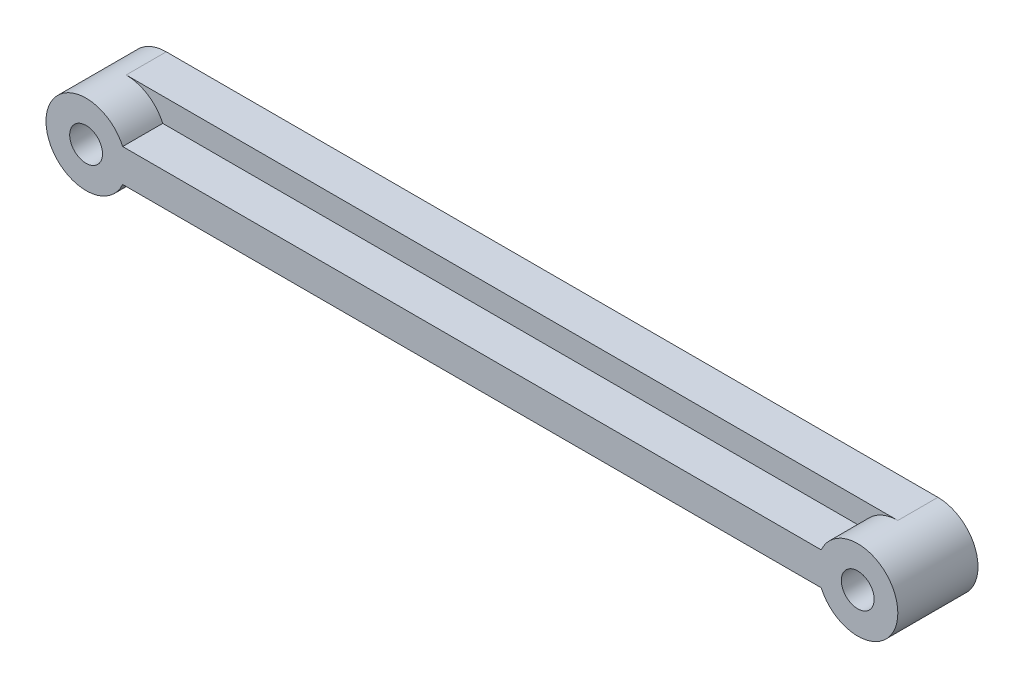
ISO-10303-21;
HEADER;
FILE_DESCRIPTION(('STEP AP214'),'2;1');
FILE_NAME('part.step','',(''),(''),'','','');
FILE_SCHEMA(('AUTOMOTIVE_DESIGN { 1 0 10303 214 1 1 1 1 }'));
ENDSEC;
DATA;
#1=APPLICATION_CONTEXT('core data for automotive mechanical design processes');
#2=APPLICATION_PROTOCOL_DEFINITION('international standard','automotive_design',2000,#1);
#3=PRODUCT_CONTEXT('',#1,'mechanical');
#4=PRODUCT('Part','Part','',(#3));
#5=PRODUCT_RELATED_PRODUCT_CATEGORY('part','',(#4));
#6=PRODUCT_DEFINITION_FORMATION('','',#4);
#7=PRODUCT_DEFINITION_CONTEXT('part definition',#1,'design');
#8=PRODUCT_DEFINITION('design','',#6,#7);
#9=PRODUCT_DEFINITION_SHAPE('','',#8);
#10=(LENGTH_UNIT() NAMED_UNIT(*) SI_UNIT(.MILLI.,.METRE.));
#11=(NAMED_UNIT(*) PLANE_ANGLE_UNIT() SI_UNIT($,.RADIAN.));
#12=(NAMED_UNIT(*) SI_UNIT($,.STERADIAN.) SOLID_ANGLE_UNIT());
#13=UNCERTAINTY_MEASURE_WITH_UNIT(LENGTH_MEASURE(1.E-05),#10,'distance_accuracy_value','');
#14=(GEOMETRIC_REPRESENTATION_CONTEXT(3) GLOBAL_UNCERTAINTY_ASSIGNED_CONTEXT((#13)) GLOBAL_UNIT_ASSIGNED_CONTEXT((#10,
#11,#12)) REPRESENTATION_CONTEXT('',''));
#15=CARTESIAN_POINT('',(0.,0.,0.));
#16=DIRECTION('',(0.,0.,1.));
#17=DIRECTION('',(1.,0.,0.));
#18=AXIS2_PLACEMENT_3D('',#15,#16,#17);
#19=CARTESIAN_POINT('',(-45.8845054429269,0.,0.));
#20=DIRECTION('',(0.,0.,1.));
#21=DIRECTION('',(1.,0.,0.));
#22=AXIS2_PLACEMENT_3D('',#19,#20,#21);
#23=PLANE('',#22);
#24=CARTESIAN_POINT('',(-7.38450544292694,0.,0.));
#25=DIRECTION('',(0.,0.,1.));
#26=DIRECTION('',(1.,0.,0.));
#27=AXIS2_PLACEMENT_3D('',#24,#25,#26);
#28=CIRCLE('',#27,2.);
#29=CARTESIAN_POINT('',(-9.20907538642467,-0.819112032193816,0.));
#30=VERTEX_POINT('',#29);
#31=CARTESIAN_POINT('',(-7.38450544292694,-2.,0.));
#32=VERTEX_POINT('',#31);
#33=EDGE_CURVE('E57',#30,#32,#28,.T.);
#34=ORIENTED_EDGE('',*,*,#33,.F.);
#35=DIRECTION('',(1.,0.,0.));
#36=VECTOR('',#35,1.);
#37=CARTESIAN_POINT('',(-44.0599354994292,-0.819112032193814,0.));
#38=LINE('',#37,#36);
#39=CARTESIAN_POINT('',(-44.0599354994292,-0.819112032193815,0.));
#40=VERTEX_POINT('',#39);
#41=EDGE_CURVE('E61',#40,#30,#38,.T.);
#42=ORIENTED_EDGE('',*,*,#41,.F.);
#43=CARTESIAN_POINT('',(-45.8845054429269,0.,0.));
#44=DIRECTION('',(0.,0.,1.));
#45=DIRECTION('',(1.,0.,0.));
#46=AXIS2_PLACEMENT_3D('',#43,#44,#45);
#47=CIRCLE('',#46,2.);
#48=CARTESIAN_POINT('',(-45.8845054429269,-2.,0.));
#49=VERTEX_POINT('',#48);
#50=EDGE_CURVE('E11',#49,#40,#47,.T.);
#51=ORIENTED_EDGE('',*,*,#50,.F.);
#52=DIRECTION('',(1.,0.,0.));
#53=VECTOR('',#52,1.);
#54=CARTESIAN_POINT('',(-45.8845054429269,-2.,0.));
#55=LINE('',#54,#53);
#56=EDGE_CURVE('E141',#49,#32,#55,.T.);
#57=ORIENTED_EDGE('',*,*,#56,.T.);
#58=EDGE_LOOP('',(#34,#42,#51,#57));
#59=FACE_BOUND('',#58,.T.);
#60=ADVANCED_FACE('F39',(#59),#23,.T.);
#61=CARTESIAN_POINT('',(-45.8845054429269,0.,-2.));
#62=DIRECTION('',(0.,0.,1.));
#63=DIRECTION('',(1.,0.,0.));
#64=AXIS2_PLACEMENT_3D('',#61,#62,#63);
#65=CYLINDRICAL_SURFACE('',#64,2.);
#66=DIRECTION('',(0.,0.,1.));
#67=VECTOR('',#66,1.);
#68=CARTESIAN_POINT('',(-45.8845054429269,-2.,-2.));
#69=LINE('',#68,#67);
#70=CARTESIAN_POINT('',(-45.8845054429269,-2.,-2.));
#71=VERTEX_POINT('',#70);
#72=EDGE_CURVE('E43',#71,#49,#69,.T.);
#73=ORIENTED_EDGE('',*,*,#72,.T.);
#74=ORIENTED_EDGE('',*,*,#50,.T.);
#75=DIRECTION('',(0.,0.,-1.));
#76=VECTOR('',#75,1.);
#77=CARTESIAN_POINT('',(-44.0599354994292,-0.819112032193815,2.));
#78=LINE('',#77,#76);
#79=CARTESIAN_POINT('',(-44.0599354994292,-0.819112032193815,2.));
#80=VERTEX_POINT('',#79);
#81=EDGE_CURVE('E135',#80,#40,#78,.T.);
#82=ORIENTED_EDGE('',*,*,#81,.F.);
#83=CARTESIAN_POINT('',(-45.8845054429269,0.,2.));
#84=DIRECTION('',(0.,0.,1.));
#85=DIRECTION('',(1.,0.,0.));
#86=AXIS2_PLACEMENT_3D('',#83,#84,#85);
#87=CIRCLE('',#86,2.);
#88=CARTESIAN_POINT('',(-44.0599354994292,0.819112032193814,2.));
#89=VERTEX_POINT('',#88);
#90=EDGE_CURVE('E115',#89,#80,#87,.T.);
#91=ORIENTED_EDGE('',*,*,#90,.F.);
#92=DIRECTION('',(0.,0.,-1.));
#93=VECTOR('',#92,1.);
#94=CARTESIAN_POINT('',(-44.0599354994292,0.819112032193814,2.));
#95=LINE('',#94,#93);
#96=CARTESIAN_POINT('',(-44.0599354994292,0.819112032193814,0.));
#97=VERTEX_POINT('',#96);
#98=EDGE_CURVE('E112',#89,#97,#95,.T.);
#99=ORIENTED_EDGE('',*,*,#98,.T.);
#100=CARTESIAN_POINT('',(-45.8845054429269,2.,0.));
#101=VERTEX_POINT('',#100);
#102=EDGE_CURVE('E50',#97,#101,#47,.T.);
#103=ORIENTED_EDGE('',*,*,#102,.T.);
#104=DIRECTION('',(0.,0.,1.));
#105=VECTOR('',#104,1.);
#106=CARTESIAN_POINT('',(-45.8845054429269,2.,-2.));
#107=LINE('',#106,#105);
#108=CARTESIAN_POINT('',(-45.8845054429269,2.,-2.));
#109=VERTEX_POINT('',#108);
#110=EDGE_CURVE('E158',#109,#101,#107,.T.);
#111=ORIENTED_EDGE('',*,*,#110,.F.);
#112=CARTESIAN_POINT('',(-45.8845054429269,0.,-2.));
#113=DIRECTION('',(0.,0.,1.));
#114=DIRECTION('',(1.,0.,0.));
#115=AXIS2_PLACEMENT_3D('',#112,#113,#114);
#116=CIRCLE('',#115,2.);
#117=EDGE_CURVE('E142',#109,#71,#116,.T.);
#118=ORIENTED_EDGE('',*,*,#117,.T.);
#119=EDGE_LOOP('',(#73,#74,#82,#91,#99,#103,#111,#118));
#120=FACE_BOUND('',#119,.T.);
#121=ADVANCED_FACE('F41',(#120),#65,.T.);
#122=CARTESIAN_POINT('',(-45.8845054429269,2.,-2.));
#123=DIRECTION('',(0.,1.,0.));
#124=DIRECTION('',(-1.,0.,0.));
#125=AXIS2_PLACEMENT_3D('',#122,#123,#124);
#126=PLANE('',#125);
#127=DIRECTION('',(-1.,0.,0.));
#128=VECTOR('',#127,1.);
#129=CARTESIAN_POINT('',(-45.8845054429269,2.,0.));
#130=LINE('',#129,#128);
#131=CARTESIAN_POINT('',(-7.38450544292694,2.,0.));
#132=VERTEX_POINT('',#131);
#133=EDGE_CURVE('E146',#132,#101,#130,.T.);
#134=ORIENTED_EDGE('',*,*,#133,.F.);
#135=DIRECTION('',(0.,0.,1.));
#136=VECTOR('',#135,1.);
#137=CARTESIAN_POINT('',(-7.38450544292694,2.,-2.));
#138=LINE('',#137,#136);
#139=CARTESIAN_POINT('',(-7.38450544292694,2.,-2.));
#140=VERTEX_POINT('',#139);
#141=EDGE_CURVE('E160',#140,#132,#138,.T.);
#142=ORIENTED_EDGE('',*,*,#141,.F.);
#143=DIRECTION('',(-1.,0.,0.));
#144=VECTOR('',#143,1.);
#145=CARTESIAN_POINT('',(-45.8845054429269,2.,-2.));
#146=LINE('',#145,#144);
#147=EDGE_CURVE('E152',#140,#109,#146,.T.);
#148=ORIENTED_EDGE('',*,*,#147,.T.);
#149=ORIENTED_EDGE('',*,*,#110,.T.);
#150=EDGE_LOOP('',(#134,#142,#148,#149));
#151=FACE_BOUND('',#150,.T.);
#152=ADVANCED_FACE('F211',(#151),#126,.T.);
#153=CARTESIAN_POINT('',(-7.38450544292694,0.,-2.));
#154=DIRECTION('',(0.,0.,1.));
#155=DIRECTION('',(1.,0.,0.));
#156=AXIS2_PLACEMENT_3D('',#153,#154,#155);
#157=CYLINDRICAL_SURFACE('',#156,2.);
#158=ORIENTED_EDGE('',*,*,#141,.T.);
#159=CARTESIAN_POINT('',(-9.20907538642467,0.819112032193816,0.));
#160=VERTEX_POINT('',#159);
#161=EDGE_CURVE('E48',#132,#160,#28,.T.);
#162=ORIENTED_EDGE('',*,*,#161,.T.);
#163=DIRECTION('',(0.,0.,-1.));
#164=VECTOR('',#163,1.);
#165=CARTESIAN_POINT('',(-9.20907538642467,0.819112032193816,2.));
#166=LINE('',#165,#164);
#167=CARTESIAN_POINT('',(-9.20907538642467,0.819112032193816,2.));
#168=VERTEX_POINT('',#167);
#169=EDGE_CURVE('E110',#168,#160,#166,.T.);
#170=ORIENTED_EDGE('',*,*,#169,.F.);
#171=CARTESIAN_POINT('',(-7.38450544292694,0.,2.));
#172=DIRECTION('',(0.,0.,1.));
#173=DIRECTION('',(1.,0.,0.));
#174=AXIS2_PLACEMENT_3D('',#171,#172,#173);
#175=CIRCLE('',#174,2.);
#176=CARTESIAN_POINT('',(-9.20907538642467,-0.819112032193816,2.));
#177=VERTEX_POINT('',#176);
#178=EDGE_CURVE('E116',#177,#168,#175,.T.);
#179=ORIENTED_EDGE('',*,*,#178,.F.);
#180=DIRECTION('',(0.,0.,-1.));
#181=VECTOR('',#180,1.);
#182=CARTESIAN_POINT('',(-9.20907538642467,-0.819112032193816,2.));
#183=LINE('',#182,#181);
#184=EDGE_CURVE('E172',#177,#30,#183,.T.);
#185=ORIENTED_EDGE('',*,*,#184,.T.);
#186=ORIENTED_EDGE('',*,*,#33,.T.);
#187=DIRECTION('',(0.,0.,1.));
#188=VECTOR('',#187,1.);
#189=CARTESIAN_POINT('',(-7.38450544292694,-2.,-2.));
#190=LINE('',#189,#188);
#191=CARTESIAN_POINT('',(-7.38450544292694,-2.,-2.));
#192=VERTEX_POINT('',#191);
#193=EDGE_CURVE('E161',#192,#32,#190,.T.);
#194=ORIENTED_EDGE('',*,*,#193,.F.);
#195=CARTESIAN_POINT('',(-7.38450544292694,0.,-2.));
#196=DIRECTION('',(0.,0.,1.));
#197=DIRECTION('',(1.,0.,0.));
#198=AXIS2_PLACEMENT_3D('',#195,#196,#197);
#199=CIRCLE('',#198,2.);
#200=EDGE_CURVE('E149',#192,#140,#199,.T.);
#201=ORIENTED_EDGE('',*,*,#200,.T.);
#202=EDGE_LOOP('',(#158,#162,#170,#179,#185,#186,#194,#201));
#203=FACE_BOUND('',#202,.T.);
#204=ADVANCED_FACE('F129',(#203),#157,.T.);
#205=CARTESIAN_POINT('',(-45.8845054429269,-2.,-2.));
#206=DIRECTION('',(0.,-1.,0.));
#207=DIRECTION('',(1.,0.,0.));
#208=AXIS2_PLACEMENT_3D('',#205,#206,#207);
#209=PLANE('',#208);
#210=ORIENTED_EDGE('',*,*,#56,.F.);
#211=ORIENTED_EDGE('',*,*,#72,.F.);
#212=DIRECTION('',(1.,0.,0.));
#213=VECTOR('',#212,1.);
#214=CARTESIAN_POINT('',(-45.8845054429269,-2.,-2.));
#215=LINE('',#214,#213);
#216=EDGE_CURVE('E145',#71,#192,#215,.T.);
#217=ORIENTED_EDGE('',*,*,#216,.T.);
#218=ORIENTED_EDGE('',*,*,#193,.T.);
#219=EDGE_LOOP('',(#210,#211,#217,#218));
#220=FACE_BOUND('',#219,.T.);
#221=ADVANCED_FACE('F170',(#220),#209,.T.);
#222=CARTESIAN_POINT('',(-45.8845054429269,0.,-2.));
#223=DIRECTION('',(0.,0.,1.));
#224=DIRECTION('',(1.,0.,0.));
#225=AXIS2_PLACEMENT_3D('',#222,#223,#224);
#226=PLANE('',#225);
#227=CARTESIAN_POINT('',(-7.38450544292694,0.,-2.));
#228=DIRECTION('',(0.,0.,1.));
#229=DIRECTION('',(1.,0.,0.));
#230=AXIS2_PLACEMENT_3D('',#227,#228,#229);
#231=CIRCLE('',#230,0.819112032193816);
#232=CARTESIAN_POINT('',(-6.56539341073312,0.,-2.));
#233=VERTEX_POINT('',#232);
#234=EDGE_CURVE('E130',#233,#233,#231,.T.);
#235=ORIENTED_EDGE('',*,*,#234,.T.);
#236=EDGE_LOOP('',(#235));
#237=FACE_BOUND('',#236,.T.);
#238=CARTESIAN_POINT('',(-45.8845054429269,0.,-2.));
#239=DIRECTION('',(0.,0.,1.));
#240=DIRECTION('',(1.,0.,0.));
#241=AXIS2_PLACEMENT_3D('',#238,#239,#240);
#242=CIRCLE('',#241,0.819112032193814);
#243=CARTESIAN_POINT('',(-45.0653934107331,0.,-2.));
#244=VERTEX_POINT('',#243);
#245=EDGE_CURVE('E133',#244,#244,#242,.T.);
#246=ORIENTED_EDGE('',*,*,#245,.T.);
#247=EDGE_LOOP('',(#246));
#248=FACE_BOUND('',#247,.T.);
#249=ORIENTED_EDGE('',*,*,#117,.F.);
#250=ORIENTED_EDGE('',*,*,#147,.F.);
#251=ORIENTED_EDGE('',*,*,#200,.F.);
#252=ORIENTED_EDGE('',*,*,#216,.F.);
#253=EDGE_LOOP('',(#249,#250,#251,#252));
#254=FACE_BOUND('',#253,.T.);
#255=ADVANCED_FACE('F215',(#237,#248,#254),#226,.F.);
#256=ORIENTED_EDGE('',*,*,#161,.F.);
#257=ORIENTED_EDGE('',*,*,#133,.T.);
#258=ORIENTED_EDGE('',*,*,#102,.F.);
#259=DIRECTION('',(-1.,0.,0.));
#260=VECTOR('',#259,1.);
#261=CARTESIAN_POINT('',(-44.0599354994292,0.819112032193814,0.));
#262=LINE('',#261,#260);
#263=EDGE_CURVE('E173',#160,#97,#262,.T.);
#264=ORIENTED_EDGE('',*,*,#263,.F.);
#265=EDGE_LOOP('',(#256,#257,#258,#264));
#266=FACE_BOUND('',#265,.T.);
#267=ADVANCED_FACE('F207',(#266),#23,.T.);
#268=CARTESIAN_POINT('',(-45.8845054429269,0.,-2.));
#269=DIRECTION('',(0.,0.,1.));
#270=DIRECTION('',(1.,0.,0.));
#271=AXIS2_PLACEMENT_3D('',#268,#269,#270);
#272=CYLINDRICAL_SURFACE('',#271,0.819112032193814);
#273=ORIENTED_EDGE('',*,*,#245,.F.);
#274=EDGE_LOOP('',(#273));
#275=FACE_BOUND('',#274,.T.);
#276=CARTESIAN_POINT('',(-45.8845054429269,0.,2.));
#277=DIRECTION('',(0.,0.,1.));
#278=DIRECTION('',(1.,0.,0.));
#279=AXIS2_PLACEMENT_3D('',#276,#277,#278);
#280=CIRCLE('',#279,0.819112032193814);
#281=CARTESIAN_POINT('',(-45.0653934107331,0.,2.));
#282=VERTEX_POINT('',#281);
#283=EDGE_CURVE('E174',#282,#282,#280,.T.);
#284=ORIENTED_EDGE('',*,*,#283,.T.);
#285=EDGE_LOOP('',(#284));
#286=FACE_BOUND('',#285,.T.);
#287=ADVANCED_FACE('F200',(#275,#286),#272,.F.);
#288=CARTESIAN_POINT('',(-7.38450544292694,0.,-2.));
#289=DIRECTION('',(0.,0.,1.));
#290=DIRECTION('',(1.,0.,0.));
#291=AXIS2_PLACEMENT_3D('',#288,#289,#290);
#292=CYLINDRICAL_SURFACE('',#291,0.819112032193816);
#293=ORIENTED_EDGE('',*,*,#234,.F.);
#294=EDGE_LOOP('',(#293));
#295=FACE_BOUND('',#294,.T.);
#296=CARTESIAN_POINT('',(-7.38450544292694,0.,2.));
#297=DIRECTION('',(0.,0.,1.));
#298=DIRECTION('',(1.,0.,0.));
#299=AXIS2_PLACEMENT_3D('',#296,#297,#298);
#300=CIRCLE('',#299,0.819112032193816);
#301=CARTESIAN_POINT('',(-6.56539341073312,0.,2.));
#302=VERTEX_POINT('',#301);
#303=EDGE_CURVE('E178',#302,#302,#300,.T.);
#304=ORIENTED_EDGE('',*,*,#303,.T.);
#305=EDGE_LOOP('',(#304));
#306=FACE_BOUND('',#305,.T.);
#307=ADVANCED_FACE('F191',(#295,#306),#292,.F.);
#308=CARTESIAN_POINT('',(-7.38450544292694,0.,2.));
#309=DIRECTION('',(0.,0.,1.));
#310=DIRECTION('',(1.,0.,0.));
#311=AXIS2_PLACEMENT_3D('',#308,#309,#310);
#312=PLANE('',#311);
#313=ORIENTED_EDGE('',*,*,#283,.F.);
#314=EDGE_LOOP('',(#313));
#315=FACE_BOUND('',#314,.T.);
#316=ORIENTED_EDGE('',*,*,#178,.T.);
#317=DIRECTION('',(-1.,0.,0.));
#318=VECTOR('',#317,1.);
#319=CARTESIAN_POINT('',(-44.0599354994292,0.819112032193814,2.));
#320=LINE('',#319,#318);
#321=EDGE_CURVE('E105',#168,#89,#320,.T.);
#322=ORIENTED_EDGE('',*,*,#321,.T.);
#323=ORIENTED_EDGE('',*,*,#90,.T.);
#324=DIRECTION('',(1.,0.,0.));
#325=VECTOR('',#324,1.);
#326=CARTESIAN_POINT('',(-44.0599354994292,-0.819112032193814,2.));
#327=LINE('',#326,#325);
#328=EDGE_CURVE('E122',#80,#177,#327,.T.);
#329=ORIENTED_EDGE('',*,*,#328,.T.);
#330=EDGE_LOOP('',(#316,#322,#323,#329));
#331=FACE_BOUND('',#330,.T.);
#332=ORIENTED_EDGE('',*,*,#303,.F.);
#333=EDGE_LOOP('',(#332));
#334=FACE_BOUND('',#333,.T.);
#335=ADVANCED_FACE('F119',(#315,#331,#334),#312,.T.);
#336=CARTESIAN_POINT('',(-44.0599354994292,0.819112032193814,2.));
#337=DIRECTION('',(0.,-1.,0.));
#338=DIRECTION('',(1.,0.,0.));
#339=AXIS2_PLACEMENT_3D('',#336,#337,#338);
#340=PLANE('',#339);
#341=ORIENTED_EDGE('',*,*,#263,.T.);
#342=ORIENTED_EDGE('',*,*,#98,.F.);
#343=ORIENTED_EDGE('',*,*,#321,.F.);
#344=ORIENTED_EDGE('',*,*,#169,.T.);
#345=EDGE_LOOP('',(#341,#342,#343,#344));
#346=FACE_BOUND('',#345,.T.);
#347=ADVANCED_FACE('F108',(#346),#340,.F.);
#348=CARTESIAN_POINT('',(-44.0599354994292,-0.819112032193814,2.));
#349=DIRECTION('',(0.,1.,0.));
#350=DIRECTION('',(-1.,0.,0.));
#351=AXIS2_PLACEMENT_3D('',#348,#349,#350);
#352=PLANE('',#351);
#353=ORIENTED_EDGE('',*,*,#41,.T.);
#354=ORIENTED_EDGE('',*,*,#184,.F.);
#355=ORIENTED_EDGE('',*,*,#328,.F.);
#356=ORIENTED_EDGE('',*,*,#81,.T.);
#357=EDGE_LOOP('',(#353,#354,#355,#356));
#358=FACE_BOUND('',#357,.T.);
#359=ADVANCED_FACE('F186',(#358),#352,.F.);
#360=CLOSED_SHELL('',(#60,#121,#152,#204,#221,#255,#267,#287,#307,#335,#347,#359));
#361=MANIFOLD_SOLID_BREP('B2',#360);
#362=ADVANCED_BREP_SHAPE_REPRESENTATION('',(#18,#361),#14);
#363=SHAPE_DEFINITION_REPRESENTATION(#9,#362);
ENDSEC;
END-ISO-10303-21;
